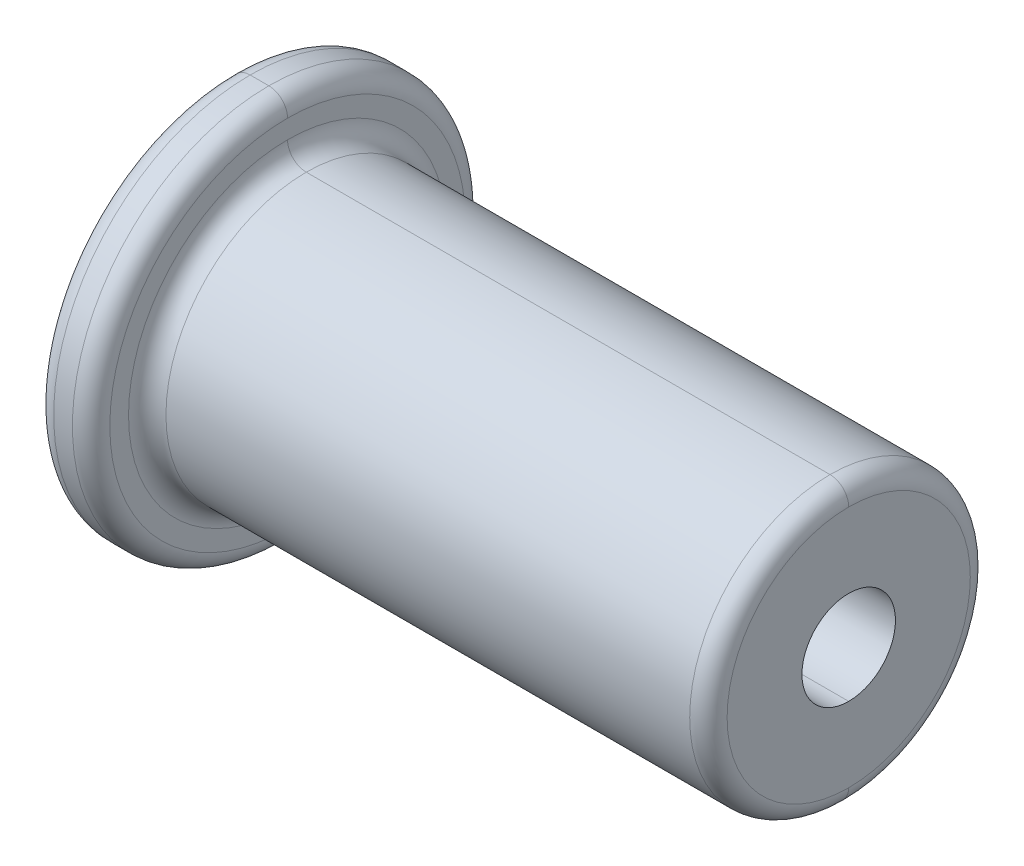
ISO-10303-21;
HEADER;
FILE_DESCRIPTION(('STEP AP214'),'2;1');
FILE_NAME('part.step','',(''),(''),'','','');
FILE_SCHEMA(('AUTOMOTIVE_DESIGN { 1 0 10303 214 1 1 1 1 }'));
ENDSEC;
DATA;
#1=APPLICATION_CONTEXT('core data for automotive mechanical design processes');
#2=APPLICATION_PROTOCOL_DEFINITION('international standard','automotive_design',2000,#1);
#3=PRODUCT_CONTEXT('',#1,'mechanical');
#4=PRODUCT('Part','Part','',(#3));
#5=PRODUCT_RELATED_PRODUCT_CATEGORY('part','',(#4));
#6=PRODUCT_DEFINITION_FORMATION('','',#4);
#7=PRODUCT_DEFINITION_CONTEXT('part definition',#1,'design');
#8=PRODUCT_DEFINITION('design','',#6,#7);
#9=PRODUCT_DEFINITION_SHAPE('','',#8);
#10=(LENGTH_UNIT() NAMED_UNIT(*) SI_UNIT(.MILLI.,.METRE.));
#11=(NAMED_UNIT(*) PLANE_ANGLE_UNIT() SI_UNIT($,.RADIAN.));
#12=(NAMED_UNIT(*) SI_UNIT($,.STERADIAN.) SOLID_ANGLE_UNIT());
#13=UNCERTAINTY_MEASURE_WITH_UNIT(LENGTH_MEASURE(1.E-05),#10,'distance_accuracy_value','');
#14=(GEOMETRIC_REPRESENTATION_CONTEXT(3) GLOBAL_UNCERTAINTY_ASSIGNED_CONTEXT((#13)) GLOBAL_UNIT_ASSIGNED_CONTEXT((#10,
#11,#12)) REPRESENTATION_CONTEXT('',''));
#15=CARTESIAN_POINT('',(0.,0.,0.));
#16=DIRECTION('',(0.,0.,1.));
#17=DIRECTION('',(1.,0.,0.));
#18=AXIS2_PLACEMENT_3D('',#15,#16,#17);
#19=CARTESIAN_POINT('',(20.1098363142858,1.5,0.));
#20=DIRECTION('',(-1.,0.,0.));
#21=DIRECTION('',(0.,1.,0.));
#22=AXIS2_PLACEMENT_3D('',#19,#20,#21);
#23=PLANE('',#22);
#24=CARTESIAN_POINT('',(20.1098363142858,-1.,0.));
#25=DIRECTION('',(-1.,0.,0.));
#26=DIRECTION('',(0.,-1.,0.));
#27=AXIS2_PLACEMENT_3D('',#24,#25,#26);
#28=CIRCLE('',#27,2.5);
#29=CARTESIAN_POINT('',(20.1098363142858,-3.5,0.));
#30=VERTEX_POINT('',#29);
#31=CARTESIAN_POINT('',(20.1098363142858,1.5,0.));
#32=VERTEX_POINT('',#31);
#33=EDGE_CURVE('E10',#30,#32,#28,.T.);
#34=ORIENTED_EDGE('',*,*,#33,.F.);
#35=CARTESIAN_POINT('',(20.1098363142858,-1.,0.));
#36=DIRECTION('',(-1.,0.,0.));
#37=DIRECTION('',(0.,-1.,0.));
#38=AXIS2_PLACEMENT_3D('',#35,#36,#37);
#39=CIRCLE('',#38,2.5);
#40=EDGE_CURVE('E377',#32,#30,#39,.T.);
#41=ORIENTED_EDGE('',*,*,#40,.F.);
#42=EDGE_LOOP('',(#34,#41));
#43=FACE_BOUND('',#42,.T.);
#44=ADVANCED_FACE('F16',(#43),#23,.F.);
#45=CARTESIAN_POINT('',(-15.5422306458491,-1.,0.));
#46=DIRECTION('',(-1.,0.,0.));
#47=DIRECTION('',(0.,-1.,0.));
#48=AXIS2_PLACEMENT_3D('',#45,#46,#47);
#49=CYLINDRICAL_SURFACE('',#48,2.5);
#50=DIRECTION('',(-1.,0.,0.));
#51=VECTOR('',#50,1.);
#52=CARTESIAN_POINT('',(-15.5422306458491,1.5,0.));
#53=LINE('',#52,#51);
#54=CARTESIAN_POINT('',(25.9464285714286,1.5,0.));
#55=VERTEX_POINT('',#54);
#56=EDGE_CURVE('E381',#55,#32,#53,.T.);
#57=ORIENTED_EDGE('',*,*,#56,.F.);
#58=CARTESIAN_POINT('',(25.9464285714286,-1.,0.));
#59=DIRECTION('',(-1.,0.,0.));
#60=DIRECTION('',(0.,-1.,0.));
#61=AXIS2_PLACEMENT_3D('',#58,#59,#60);
#62=CIRCLE('',#61,2.5);
#63=CARTESIAN_POINT('',(25.9464285714286,-3.5,0.));
#64=VERTEX_POINT('',#63);
#65=EDGE_CURVE('E27',#64,#55,#62,.T.);
#66=ORIENTED_EDGE('',*,*,#65,.F.);
#67=DIRECTION('',(-1.,0.,0.));
#68=VECTOR('',#67,1.);
#69=CARTESIAN_POINT('',(-15.5422306458491,-3.5,0.));
#70=LINE('',#69,#68);
#71=EDGE_CURVE('E265',#64,#30,#70,.T.);
#72=ORIENTED_EDGE('',*,*,#71,.T.);
#73=ORIENTED_EDGE('',*,*,#33,.T.);
#74=EDGE_LOOP('',(#57,#66,#72,#73));
#75=FACE_BOUND('',#74,.T.);
#76=ADVANCED_FACE('F465',(#75),#49,.F.);
#77=CARTESIAN_POINT('',(25.9464285714286,5.5,0.));
#78=DIRECTION('',(-1.,0.,0.));
#79=DIRECTION('',(0.,1.,0.));
#80=AXIS2_PLACEMENT_3D('',#77,#78,#79);
#81=PLANE('',#80);
#82=ORIENTED_EDGE('',*,*,#65,.T.);
#83=CARTESIAN_POINT('',(25.9464285714286,-1.,0.));
#84=DIRECTION('',(-1.,0.,0.));
#85=DIRECTION('',(0.,-1.,0.));
#86=AXIS2_PLACEMENT_3D('',#83,#84,#85);
#87=CIRCLE('',#86,2.5);
#88=EDGE_CURVE('E411',#55,#64,#87,.T.);
#89=ORIENTED_EDGE('',*,*,#88,.T.);
#90=EDGE_LOOP('',(#82,#89));
#91=FACE_BOUND('',#90,.T.);
#92=CARTESIAN_POINT('',(25.9464285714286,-1.,0.));
#93=DIRECTION('',(-1.,0.,0.));
#94=DIRECTION('',(0.,-1.,0.));
#95=AXIS2_PLACEMENT_3D('',#92,#93,#94);
#96=CIRCLE('',#95,6.5);
#97=CARTESIAN_POINT('',(25.9464285714286,-7.5,0.));
#98=VERTEX_POINT('',#97);
#99=CARTESIAN_POINT('',(25.9464285714286,5.5,0.));
#100=VERTEX_POINT('',#99);
#101=EDGE_CURVE('E260',#98,#100,#96,.T.);
#102=ORIENTED_EDGE('',*,*,#101,.F.);
#103=CARTESIAN_POINT('',(25.9464285714286,-1.,0.));
#104=DIRECTION('',(-1.,0.,0.));
#105=DIRECTION('',(0.,-1.,0.));
#106=AXIS2_PLACEMENT_3D('',#103,#104,#105);
#107=CIRCLE('',#106,6.5);
#108=EDGE_CURVE('E173',#100,#98,#107,.T.);
#109=ORIENTED_EDGE('',*,*,#108,.F.);
#110=EDGE_LOOP('',(#102,#109));
#111=FACE_BOUND('',#110,.T.);
#112=ADVANCED_FACE('F470',(#91,#111),#81,.F.);
#113=CARTESIAN_POINT('',(24.9464285714286,-1.,0.));
#114=DIRECTION('',(-1.,0.,0.));
#115=DIRECTION('',(0.,-1.,0.));
#116=AXIS2_PLACEMENT_3D('',#113,#114,#115);
#117=TOROIDAL_SURFACE('',#116,6.5,1.);
#118=CARTESIAN_POINT('',(24.9464285714286,5.5,0.));
#119=DIRECTION('',(0.,0.,1.));
#120=DIRECTION('',(0.,-1.,0.));
#121=AXIS2_PLACEMENT_3D('',#118,#119,#120);
#122=CIRCLE('',#121,1.);
#123=CARTESIAN_POINT('',(24.9464285714286,6.5,0.));
#124=VERTEX_POINT('',#123);
#125=EDGE_CURVE('E264',#100,#124,#122,.T.);
#126=ORIENTED_EDGE('',*,*,#125,.F.);
#127=ORIENTED_EDGE('',*,*,#108,.T.);
#128=CARTESIAN_POINT('',(24.9464285714286,-7.5,0.));
#129=DIRECTION('',(0.,0.,-1.));
#130=DIRECTION('',(-1.,0.,0.));
#131=AXIS2_PLACEMENT_3D('',#128,#129,#130);
#132=CIRCLE('',#131,1.);
#133=CARTESIAN_POINT('',(24.9464285714286,-8.5,0.));
#134=VERTEX_POINT('',#133);
#135=EDGE_CURVE('E236',#98,#134,#132,.T.);
#136=ORIENTED_EDGE('',*,*,#135,.T.);
#137=CARTESIAN_POINT('',(24.9464285714286,-1.,0.));
#138=DIRECTION('',(-1.,0.,0.));
#139=DIRECTION('',(0.,-1.,0.));
#140=AXIS2_PLACEMENT_3D('',#137,#138,#139);
#141=CIRCLE('',#140,7.5);
#142=EDGE_CURVE('E268',#124,#134,#141,.T.);
#143=ORIENTED_EDGE('',*,*,#142,.F.);
#144=EDGE_LOOP('',(#126,#127,#136,#143));
#145=FACE_BOUND('',#144,.T.);
#146=ADVANCED_FACE('F489',(#145),#117,.T.);
#147=CARTESIAN_POINT('',(-15.5422306458491,-1.,0.));
#148=DIRECTION('',(-1.,0.,0.));
#149=DIRECTION('',(0.,-1.,0.));
#150=AXIS2_PLACEMENT_3D('',#147,#148,#149);
#151=CYLINDRICAL_SURFACE('',#150,7.5);
#152=DIRECTION('',(-1.,0.,0.));
#153=VECTOR('',#152,1.);
#154=CARTESIAN_POINT('',(-15.5422306458491,6.5,0.));
#155=LINE('',#154,#153);
#156=CARTESIAN_POINT('',(-3.05357142857142,6.5,0.));
#157=VERTEX_POINT('',#156);
#158=EDGE_CURVE('E210',#124,#157,#155,.T.);
#159=ORIENTED_EDGE('',*,*,#158,.F.);
#160=ORIENTED_EDGE('',*,*,#142,.T.);
#161=DIRECTION('',(-1.,0.,0.));
#162=VECTOR('',#161,1.);
#163=CARTESIAN_POINT('',(-15.5422306458491,-8.5,0.));
#164=LINE('',#163,#162);
#165=CARTESIAN_POINT('',(-3.05357142857142,-8.5,0.));
#166=VERTEX_POINT('',#165);
#167=EDGE_CURVE('E213',#134,#166,#164,.T.);
#168=ORIENTED_EDGE('',*,*,#167,.T.);
#169=CARTESIAN_POINT('',(-3.05357142857142,-1.,0.));
#170=DIRECTION('',(-1.,0.,0.));
#171=DIRECTION('',(0.,-1.,0.));
#172=AXIS2_PLACEMENT_3D('',#169,#170,#171);
#173=CIRCLE('',#172,7.5);
#174=EDGE_CURVE('E206',#157,#166,#173,.T.);
#175=ORIENTED_EDGE('',*,*,#174,.F.);
#176=EDGE_LOOP('',(#159,#160,#168,#175));
#177=FACE_BOUND('',#176,.T.);
#178=ADVANCED_FACE('F208',(#177),#151,.T.);
#179=CARTESIAN_POINT('',(-3.05357142857144,-1.,0.));
#180=DIRECTION('',(-1.,0.,0.));
#181=DIRECTION('',(0.,-1.,0.));
#182=AXIS2_PLACEMENT_3D('',#179,#180,#181);
#183=TOROIDAL_SURFACE('',#182,8.5,1.);
#184=CARTESIAN_POINT('',(-3.05357142857144,7.5,0.));
#185=DIRECTION('',(0.,0.,1.));
#186=DIRECTION('',(0.,-1.,0.));
#187=AXIS2_PLACEMENT_3D('',#184,#185,#186);
#188=CIRCLE('',#187,1.);
#189=CARTESIAN_POINT('',(-4.05357142857144,7.5,0.));
#190=VERTEX_POINT('',#189);
#191=EDGE_CURVE('E218',#190,#157,#188,.T.);
#192=ORIENTED_EDGE('',*,*,#191,.F.);
#193=CARTESIAN_POINT('',(-4.05357142857144,-1.,0.));
#194=DIRECTION('',(-1.,0.,0.));
#195=DIRECTION('',(0.,-1.,0.));
#196=AXIS2_PLACEMENT_3D('',#193,#194,#195);
#197=CIRCLE('',#196,8.5);
#198=CARTESIAN_POINT('',(-4.05357142857144,-9.5,0.));
#199=VERTEX_POINT('',#198);
#200=EDGE_CURVE('E189',#199,#190,#197,.T.);
#201=ORIENTED_EDGE('',*,*,#200,.F.);
#202=CARTESIAN_POINT('',(-3.05357142857144,-9.5,0.));
#203=DIRECTION('',(0.,0.,-1.));
#204=DIRECTION('',(-1.,0.,0.));
#205=AXIS2_PLACEMENT_3D('',#202,#203,#204);
#206=CIRCLE('',#205,1.);
#207=EDGE_CURVE('E217',#199,#166,#206,.T.);
#208=ORIENTED_EDGE('',*,*,#207,.T.);
#209=CARTESIAN_POINT('',(-3.05357142857142,-1.,0.));
#210=DIRECTION('',(-1.,0.,0.));
#211=DIRECTION('',(0.,-1.,0.));
#212=AXIS2_PLACEMENT_3D('',#209,#210,#211);
#213=CIRCLE('',#212,7.5);
#214=EDGE_CURVE('E226',#166,#157,#213,.T.);
#215=ORIENTED_EDGE('',*,*,#214,.T.);
#216=EDGE_LOOP('',(#192,#201,#208,#215));
#217=FACE_BOUND('',#216,.T.);
#218=ADVANCED_FACE('F227',(#217),#183,.F.);
#219=CARTESIAN_POINT('',(-4.05357142857144,7.5,0.));
#220=DIRECTION('',(-1.,0.,0.));
#221=DIRECTION('',(0.,1.,0.));
#222=AXIS2_PLACEMENT_3D('',#219,#220,#221);
#223=PLANE('',#222);
#224=ORIENTED_EDGE('',*,*,#200,.T.);
#225=CARTESIAN_POINT('',(-4.05357142857144,-1.,0.));
#226=DIRECTION('',(-1.,0.,0.));
#227=DIRECTION('',(0.,-1.,0.));
#228=AXIS2_PLACEMENT_3D('',#225,#226,#227);
#229=CIRCLE('',#228,8.5);
#230=EDGE_CURVE('E223',#190,#199,#229,.T.);
#231=ORIENTED_EDGE('',*,*,#230,.T.);
#232=EDGE_LOOP('',(#224,#231));
#233=FACE_BOUND('',#232,.T.);
#234=CARTESIAN_POINT('',(-4.05357142857144,-1.,0.));
#235=DIRECTION('',(-1.,0.,0.));
#236=DIRECTION('',(0.,-1.,0.));
#237=AXIS2_PLACEMENT_3D('',#234,#235,#236);
#238=CIRCLE('',#237,9.5);
#239=CARTESIAN_POINT('',(-4.05357142857144,-10.5,0.));
#240=VERTEX_POINT('',#239);
#241=CARTESIAN_POINT('',(-4.05357142857144,8.5,0.));
#242=VERTEX_POINT('',#241);
#243=EDGE_CURVE('E291',#240,#242,#238,.T.);
#244=ORIENTED_EDGE('',*,*,#243,.F.);
#245=CARTESIAN_POINT('',(-4.05357142857144,-1.,0.));
#246=DIRECTION('',(-1.,0.,0.));
#247=DIRECTION('',(0.,-1.,0.));
#248=AXIS2_PLACEMENT_3D('',#245,#246,#247);
#249=CIRCLE('',#248,9.5);
#250=EDGE_CURVE('E288',#242,#240,#249,.T.);
#251=ORIENTED_EDGE('',*,*,#250,.F.);
#252=EDGE_LOOP('',(#244,#251));
#253=FACE_BOUND('',#252,.T.);
#254=ADVANCED_FACE('F503',(#233,#253),#223,.F.);
#255=CARTESIAN_POINT('',(-5.05357142857143,-1.,0.));
#256=DIRECTION('',(-1.,0.,0.));
#257=DIRECTION('',(0.,-1.,0.));
#258=AXIS2_PLACEMENT_3D('',#255,#256,#257);
#259=TOROIDAL_SURFACE('',#258,9.5,1.);
#260=CARTESIAN_POINT('',(-5.05357142857143,8.5,0.));
#261=DIRECTION('',(0.,0.,1.));
#262=DIRECTION('',(0.,-1.,0.));
#263=AXIS2_PLACEMENT_3D('',#260,#261,#262);
#264=CIRCLE('',#263,1.);
#265=CARTESIAN_POINT('',(-5.05357142857144,9.5,0.));
#266=VERTEX_POINT('',#265);
#267=EDGE_CURVE('E302',#242,#266,#264,.T.);
#268=ORIENTED_EDGE('',*,*,#267,.F.);
#269=ORIENTED_EDGE('',*,*,#250,.T.);
#270=CARTESIAN_POINT('',(-5.05357142857143,-10.5,0.));
#271=DIRECTION('',(0.,0.,-1.));
#272=DIRECTION('',(-1.,0.,0.));
#273=AXIS2_PLACEMENT_3D('',#270,#271,#272);
#274=CIRCLE('',#273,1.);
#275=CARTESIAN_POINT('',(-5.05357142857144,-11.5,0.));
#276=VERTEX_POINT('',#275);
#277=EDGE_CURVE('E269',#240,#276,#274,.T.);
#278=ORIENTED_EDGE('',*,*,#277,.T.);
#279=CARTESIAN_POINT('',(-5.05357142857144,-1.,0.));
#280=DIRECTION('',(-1.,0.,0.));
#281=DIRECTION('',(0.,-1.,0.));
#282=AXIS2_PLACEMENT_3D('',#279,#280,#281);
#283=CIRCLE('',#282,10.5);
#284=EDGE_CURVE('E285',#266,#276,#283,.T.);
#285=ORIENTED_EDGE('',*,*,#284,.F.);
#286=EDGE_LOOP('',(#268,#269,#278,#285));
#287=FACE_BOUND('',#286,.T.);
#288=ADVANCED_FACE('F500',(#287),#259,.T.);
#289=CARTESIAN_POINT('',(-15.5422306458491,-1.,0.));
#290=DIRECTION('',(-1.,0.,0.));
#291=DIRECTION('',(0.,-1.,0.));
#292=AXIS2_PLACEMENT_3D('',#289,#290,#291);
#293=CYLINDRICAL_SURFACE('',#292,10.5);
#294=DIRECTION('',(-1.,0.,0.));
#295=VECTOR('',#294,1.);
#296=CARTESIAN_POINT('',(-15.5422306458491,9.5,0.));
#297=LINE('',#296,#295);
#298=CARTESIAN_POINT('',(-6.05357142857143,9.5,0.));
#299=VERTEX_POINT('',#298);
#300=EDGE_CURVE('E273',#266,#299,#297,.T.);
#301=ORIENTED_EDGE('',*,*,#300,.F.);
#302=ORIENTED_EDGE('',*,*,#284,.T.);
#303=DIRECTION('',(-1.,0.,0.));
#304=VECTOR('',#303,1.);
#305=CARTESIAN_POINT('',(-15.5422306458491,-11.5,0.));
#306=LINE('',#305,#304);
#307=CARTESIAN_POINT('',(-6.05357142857143,-11.5,0.));
#308=VERTEX_POINT('',#307);
#309=EDGE_CURVE('E352',#276,#308,#306,.T.);
#310=ORIENTED_EDGE('',*,*,#309,.T.);
#311=CARTESIAN_POINT('',(-6.05357142857143,-1.,0.));
#312=DIRECTION('',(-1.,0.,0.));
#313=DIRECTION('',(0.,-1.,0.));
#314=AXIS2_PLACEMENT_3D('',#311,#312,#313);
#315=CIRCLE('',#314,10.5);
#316=EDGE_CURVE('E20',#299,#308,#315,.T.);
#317=ORIENTED_EDGE('',*,*,#316,.F.);
#318=EDGE_LOOP('',(#301,#302,#310,#317));
#319=FACE_BOUND('',#318,.T.);
#320=ADVANCED_FACE('F502',(#319),#293,.T.);
#321=CARTESIAN_POINT('',(-6.05357142857143,-1.,0.));
#322=DIRECTION('',(-1.,0.,0.));
#323=DIRECTION('',(0.,-1.,0.));
#324=AXIS2_PLACEMENT_3D('',#321,#322,#323);
#325=TOROIDAL_SURFACE('',#324,9.5,1.);
#326=CARTESIAN_POINT('',(-6.05357142857143,8.5,0.));
#327=DIRECTION('',(0.,0.,1.));
#328=DIRECTION('',(0.,-1.,0.));
#329=AXIS2_PLACEMENT_3D('',#326,#327,#328);
#330=CIRCLE('',#329,1.);
#331=CARTESIAN_POINT('',(-7.05357142857143,8.5,0.));
#332=VERTEX_POINT('',#331);
#333=EDGE_CURVE('E314',#299,#332,#330,.T.);
#334=ORIENTED_EDGE('',*,*,#333,.F.);
#335=ORIENTED_EDGE('',*,*,#316,.T.);
#336=CARTESIAN_POINT('',(-6.05357142857143,-10.5,0.));
#337=DIRECTION('',(0.,0.,-1.));
#338=DIRECTION('',(-1.,0.,0.));
#339=AXIS2_PLACEMENT_3D('',#336,#337,#338);
#340=CIRCLE('',#339,1.);
#341=CARTESIAN_POINT('',(-7.05357142857143,-10.5,0.));
#342=VERTEX_POINT('',#341);
#343=EDGE_CURVE('E244',#308,#342,#340,.T.);
#344=ORIENTED_EDGE('',*,*,#343,.T.);
#345=CARTESIAN_POINT('',(-7.05357142857143,-1.,0.));
#346=DIRECTION('',(-1.,0.,0.));
#347=DIRECTION('',(0.,-1.,0.));
#348=AXIS2_PLACEMENT_3D('',#345,#346,#347);
#349=CIRCLE('',#348,9.5);
#350=EDGE_CURVE('E319',#332,#342,#349,.T.);
#351=ORIENTED_EDGE('',*,*,#350,.F.);
#352=EDGE_LOOP('',(#334,#335,#344,#351));
#353=FACE_BOUND('',#352,.T.);
#354=ADVANCED_FACE('F509',(#353),#325,.T.);
#355=CARTESIAN_POINT('',(-7.05357142857143,8.5,0.));
#356=DIRECTION('',(1.,0.,0.));
#357=DIRECTION('',(0.,1.,0.));
#358=AXIS2_PLACEMENT_3D('',#355,#356,#357);
#359=PLANE('',#358);
#360=CARTESIAN_POINT('',(-7.05357142857143,-1.,0.));
#361=DIRECTION('',(-1.,0.,0.));
#362=DIRECTION('',(0.,-1.,0.));
#363=AXIS2_PLACEMENT_3D('',#360,#361,#362);
#364=CIRCLE('',#363,6.19642857142858);
#365=CARTESIAN_POINT('',(-7.05357142857143,-7.19642857142858,0.));
#366=VERTEX_POINT('',#365);
#367=CARTESIAN_POINT('',(-7.05357142857143,5.19642857142858,0.));
#368=VERTEX_POINT('',#367);
#369=EDGE_CURVE('E309',#366,#368,#364,.T.);
#370=ORIENTED_EDGE('',*,*,#369,.F.);
#371=CARTESIAN_POINT('',(-7.05357142857143,-1.,0.));
#372=DIRECTION('',(-1.,0.,0.));
#373=DIRECTION('',(0.,-1.,0.));
#374=AXIS2_PLACEMENT_3D('',#371,#372,#373);
#375=CIRCLE('',#374,6.19642857142858);
#376=EDGE_CURVE('E326',#368,#366,#375,.T.);
#377=ORIENTED_EDGE('',*,*,#376,.F.);
#378=EDGE_LOOP('',(#370,#377));
#379=FACE_BOUND('',#378,.T.);
#380=CARTESIAN_POINT('',(-7.05357142857143,-1.,0.));
#381=DIRECTION('',(-1.,0.,0.));
#382=DIRECTION('',(0.,-1.,0.));
#383=AXIS2_PLACEMENT_3D('',#380,#381,#382);
#384=CIRCLE('',#383,9.5);
#385=EDGE_CURVE('E249',#342,#332,#384,.T.);
#386=ORIENTED_EDGE('',*,*,#385,.T.);
#387=ORIENTED_EDGE('',*,*,#350,.T.);
#388=EDGE_LOOP('',(#386,#387));
#389=FACE_BOUND('',#388,.T.);
#390=ADVANCED_FACE('F533',(#379,#389),#359,.F.);
#391=CARTESIAN_POINT('',(-8.05357142857143,-1.,0.));
#392=DIRECTION('',(-1.,0.,0.));
#393=DIRECTION('',(0.,-1.,0.));
#394=AXIS2_PLACEMENT_3D('',#391,#392,#393);
#395=TOROIDAL_SURFACE('',#394,6.19642857142857,1.);
#396=CARTESIAN_POINT('',(-8.05357142857143,5.19642857142857,0.));
#397=DIRECTION('',(0.,0.,1.));
#398=DIRECTION('',(0.,-1.,0.));
#399=AXIS2_PLACEMENT_3D('',#396,#397,#398);
#400=CIRCLE('',#399,1.);
#401=CARTESIAN_POINT('',(-8.05357142857144,4.19642857142857,0.));
#402=VERTEX_POINT('',#401);
#403=EDGE_CURVE('E322',#402,#368,#400,.T.);
#404=ORIENTED_EDGE('',*,*,#403,.F.);
#405=CARTESIAN_POINT('',(-8.05357142857144,-1.,0.));
#406=DIRECTION('',(-1.,0.,0.));
#407=DIRECTION('',(0.,-1.,0.));
#408=AXIS2_PLACEMENT_3D('',#405,#406,#407);
#409=CIRCLE('',#408,5.19642857142857);
#410=CARTESIAN_POINT('',(-8.05357142857144,-6.19642857142857,0.));
#411=VERTEX_POINT('',#410);
#412=EDGE_CURVE('E296',#411,#402,#409,.T.);
#413=ORIENTED_EDGE('',*,*,#412,.F.);
#414=CARTESIAN_POINT('',(-8.05357142857143,-7.19642857142857,0.));
#415=DIRECTION('',(0.,0.,-1.));
#416=DIRECTION('',(-1.,0.,0.));
#417=AXIS2_PLACEMENT_3D('',#414,#415,#416);
#418=CIRCLE('',#417,1.);
#419=EDGE_CURVE('E346',#411,#366,#418,.T.);
#420=ORIENTED_EDGE('',*,*,#419,.T.);
#421=ORIENTED_EDGE('',*,*,#369,.T.);
#422=EDGE_LOOP('',(#404,#413,#420,#421));
#423=FACE_BOUND('',#422,.T.);
#424=ADVANCED_FACE('F535',(#423),#395,.F.);
#425=CARTESIAN_POINT('',(-15.5422306458491,-1.,0.));
#426=DIRECTION('',(-1.,0.,0.));
#427=DIRECTION('',(0.,-1.,0.));
#428=AXIS2_PLACEMENT_3D('',#425,#426,#427);
#429=CYLINDRICAL_SURFACE('',#428,5.19642857142857);
#430=DIRECTION('',(-1.,0.,0.));
#431=VECTOR('',#430,1.);
#432=CARTESIAN_POINT('',(-15.5422306458491,4.19642857142857,0.));
#433=LINE('',#432,#431);
#434=CARTESIAN_POINT('',(-8.10714285714285,4.19642857142857,0.));
#435=VERTEX_POINT('',#434);
#436=EDGE_CURVE('E292',#402,#435,#433,.T.);
#437=ORIENTED_EDGE('',*,*,#436,.F.);
#438=CARTESIAN_POINT('',(-8.05357142857144,-1.,0.));
#439=DIRECTION('',(-1.,0.,0.));
#440=DIRECTION('',(0.,-1.,0.));
#441=AXIS2_PLACEMENT_3D('',#438,#439,#440);
#442=CIRCLE('',#441,5.19642857142857);
#443=EDGE_CURVE('E248',#402,#411,#442,.T.);
#444=ORIENTED_EDGE('',*,*,#443,.T.);
#445=DIRECTION('',(-1.,0.,0.));
#446=VECTOR('',#445,1.);
#447=CARTESIAN_POINT('',(-15.5422306458491,-6.19642857142857,0.));
#448=LINE('',#447,#446);
#449=CARTESIAN_POINT('',(-8.10714285714285,-6.19642857142857,0.));
#450=VERTEX_POINT('',#449);
#451=EDGE_CURVE('E362',#411,#450,#448,.T.);
#452=ORIENTED_EDGE('',*,*,#451,.T.);
#453=CARTESIAN_POINT('',(-8.10714285714285,-1.,0.));
#454=DIRECTION('',(-1.,0.,0.));
#455=DIRECTION('',(0.,-1.,0.));
#456=AXIS2_PLACEMENT_3D('',#453,#454,#455);
#457=CIRCLE('',#456,5.19642857142857);
#458=EDGE_CURVE('E306',#435,#450,#457,.T.);
#459=ORIENTED_EDGE('',*,*,#458,.F.);
#460=EDGE_LOOP('',(#437,#444,#452,#459));
#461=FACE_BOUND('',#460,.T.);
#462=ADVANCED_FACE('F436',(#461),#429,.T.);
#463=CARTESIAN_POINT('',(-8.10714285714286,-1.,0.));
#464=DIRECTION('',(-1.,0.,0.));
#465=DIRECTION('',(0.,-1.,0.));
#466=AXIS2_PLACEMENT_3D('',#463,#464,#465);
#467=TOROIDAL_SURFACE('',#466,4.19642857142857,1.);
#468=CARTESIAN_POINT('',(-8.10714285714286,3.19642857142858,0.));
#469=DIRECTION('',(0.,0.,1.));
#470=DIRECTION('',(0.,-1.,0.));
#471=AXIS2_PLACEMENT_3D('',#468,#469,#470);
#472=CIRCLE('',#471,1.);
#473=CARTESIAN_POINT('',(-9.10714285714286,3.19642857142857,0.));
#474=VERTEX_POINT('',#473);
#475=EDGE_CURVE('E278',#435,#474,#472,.T.);
#476=ORIENTED_EDGE('',*,*,#475,.F.);
#477=ORIENTED_EDGE('',*,*,#458,.T.);
#478=CARTESIAN_POINT('',(-8.10714285714286,-5.19642857142857,0.));
#479=DIRECTION('',(0.,0.,-1.));
#480=DIRECTION('',(-1.,0.,0.));
#481=AXIS2_PLACEMENT_3D('',#478,#479,#480);
#482=CIRCLE('',#481,1.);
#483=CARTESIAN_POINT('',(-9.10714285714286,-5.19642857142857,0.));
#484=VERTEX_POINT('',#483);
#485=EDGE_CURVE('E254',#450,#484,#482,.T.);
#486=ORIENTED_EDGE('',*,*,#485,.T.);
#487=CARTESIAN_POINT('',(-9.10714285714286,-1.,0.));
#488=DIRECTION('',(-1.,0.,0.));
#489=DIRECTION('',(0.,-1.,0.));
#490=AXIS2_PLACEMENT_3D('',#487,#488,#489);
#491=CIRCLE('',#490,4.19642857142856);
#492=EDGE_CURVE('E310',#474,#484,#491,.T.);
#493=ORIENTED_EDGE('',*,*,#492,.F.);
#494=EDGE_LOOP('',(#476,#477,#486,#493));
#495=FACE_BOUND('',#494,.T.);
#496=ADVANCED_FACE('F447',(#495),#467,.T.);
#497=CARTESIAN_POINT('',(-9.10714285714286,3.19642857142857,0.));
#498=DIRECTION('',(1.,0.,0.));
#499=DIRECTION('',(0.,1.,0.));
#500=AXIS2_PLACEMENT_3D('',#497,#498,#499);
#501=PLANE('',#500);
#502=CARTESIAN_POINT('',(-9.10714285714286,-1.,0.));
#503=DIRECTION('',(-1.,0.,0.));
#504=DIRECTION('',(0.,-1.,0.));
#505=AXIS2_PLACEMENT_3D('',#502,#503,#504);
#506=CIRCLE('',#505,3.125);
#507=CARTESIAN_POINT('',(-9.10714285714286,-4.125,0.));
#508=VERTEX_POINT('',#507);
#509=CARTESIAN_POINT('',(-9.10714285714286,2.125,0.));
#510=VERTEX_POINT('',#509);
#511=EDGE_CURVE('E301',#508,#510,#506,.T.);
#512=ORIENTED_EDGE('',*,*,#511,.F.);
#513=CARTESIAN_POINT('',(-9.10714285714286,-1.,0.));
#514=DIRECTION('',(-1.,0.,0.));
#515=DIRECTION('',(0.,-1.,0.));
#516=AXIS2_PLACEMENT_3D('',#513,#514,#515);
#517=CIRCLE('',#516,3.125);
#518=EDGE_CURVE('E279',#510,#508,#517,.T.);
#519=ORIENTED_EDGE('',*,*,#518,.F.);
#520=EDGE_LOOP('',(#512,#519));
#521=FACE_BOUND('',#520,.T.);
#522=CARTESIAN_POINT('',(-9.10714285714286,-1.,0.));
#523=DIRECTION('',(-1.,0.,0.));
#524=DIRECTION('',(0.,-1.,0.));
#525=AXIS2_PLACEMENT_3D('',#522,#523,#524);
#526=CIRCLE('',#525,4.19642857142856);
#527=EDGE_CURVE('E259',#484,#474,#526,.T.);
#528=ORIENTED_EDGE('',*,*,#527,.T.);
#529=ORIENTED_EDGE('',*,*,#492,.T.);
#530=EDGE_LOOP('',(#528,#529));
#531=FACE_BOUND('',#530,.T.);
#532=ADVANCED_FACE('F449',(#521,#531),#501,.F.);
#533=CARTESIAN_POINT('',(-15.5422306458491,-1.,0.));
#534=DIRECTION('',(-1.,0.,0.));
#535=DIRECTION('',(0.,-1.,0.));
#536=AXIS2_PLACEMENT_3D('',#533,#534,#535);
#537=CYLINDRICAL_SURFACE('',#536,3.125);
#538=DIRECTION('',(-1.,0.,0.));
#539=VECTOR('',#538,1.);
#540=CARTESIAN_POINT('',(-15.5422306458491,2.125,0.));
#541=LINE('',#540,#539);
#542=CARTESIAN_POINT('',(-8.05357142857143,2.125,0.));
#543=VERTEX_POINT('',#542);
#544=EDGE_CURVE('E284',#543,#510,#541,.T.);
#545=ORIENTED_EDGE('',*,*,#544,.F.);
#546=CARTESIAN_POINT('',(-8.05357142857143,-1.,0.));
#547=DIRECTION('',(-1.,0.,0.));
#548=DIRECTION('',(0.,-1.,0.));
#549=AXIS2_PLACEMENT_3D('',#546,#547,#548);
#550=CIRCLE('',#549,3.125);
#551=CARTESIAN_POINT('',(-8.05357142857143,-4.125,0.));
#552=VERTEX_POINT('',#551);
#553=EDGE_CURVE('E298',#552,#543,#550,.T.);
#554=ORIENTED_EDGE('',*,*,#553,.F.);
#555=DIRECTION('',(-1.,0.,0.));
#556=VECTOR('',#555,1.);
#557=CARTESIAN_POINT('',(-15.5422306458491,-4.125,0.));
#558=LINE('',#557,#556);
#559=EDGE_CURVE('E283',#552,#508,#558,.T.);
#560=ORIENTED_EDGE('',*,*,#559,.T.);
#561=ORIENTED_EDGE('',*,*,#511,.T.);
#562=EDGE_LOOP('',(#545,#554,#560,#561));
#563=FACE_BOUND('',#562,.T.);
#564=ADVANCED_FACE('F451',(#563),#537,.F.);
#565=CARTESIAN_POINT('',(-8.05357142857143,-1.,0.));
#566=DIRECTION('',(-1.,0.,0.));
#567=DIRECTION('',(0.,-1.,0.));
#568=AXIS2_PLACEMENT_3D('',#565,#566,#567);
#569=TOROIDAL_SURFACE('',#568,2.125,1.);
#570=CARTESIAN_POINT('',(-8.05357142857143,1.125,0.));
#571=DIRECTION('',(0.,0.,1.));
#572=DIRECTION('',(0.,-1.,0.));
#573=AXIS2_PLACEMENT_3D('',#570,#571,#572);
#574=CIRCLE('',#573,1.);
#575=CARTESIAN_POINT('',(-7.05357142857143,1.125,0.));
#576=VERTEX_POINT('',#575);
#577=EDGE_CURVE('E332',#576,#543,#574,.T.);
#578=ORIENTED_EDGE('',*,*,#577,.F.);
#579=CARTESIAN_POINT('',(-7.05357142857143,-1.,0.));
#580=DIRECTION('',(-1.,0.,0.));
#581=DIRECTION('',(0.,-1.,0.));
#582=AXIS2_PLACEMENT_3D('',#579,#580,#581);
#583=CIRCLE('',#582,2.125);
#584=CARTESIAN_POINT('',(-7.05357142857143,-3.125,0.));
#585=VERTEX_POINT('',#584);
#586=EDGE_CURVE('E253',#585,#576,#583,.T.);
#587=ORIENTED_EDGE('',*,*,#586,.F.);
#588=CARTESIAN_POINT('',(-8.05357142857143,-3.125,0.));
#589=DIRECTION('',(0.,0.,-1.));
#590=DIRECTION('',(-1.,0.,0.));
#591=AXIS2_PLACEMENT_3D('',#588,#589,#590);
#592=CIRCLE('',#591,1.);
#593=EDGE_CURVE('E336',#585,#552,#592,.T.);
#594=ORIENTED_EDGE('',*,*,#593,.T.);
#595=ORIENTED_EDGE('',*,*,#553,.T.);
#596=EDGE_LOOP('',(#578,#587,#594,#595));
#597=FACE_BOUND('',#596,.T.);
#598=ADVANCED_FACE('F459',(#597),#569,.F.);
#599=CARTESIAN_POINT('',(-7.05357142857143,1.125,0.));
#600=DIRECTION('',(1.,0.,0.));
#601=DIRECTION('',(0.,1.,0.));
#602=AXIS2_PLACEMENT_3D('',#599,#600,#601);
#603=PLANE('',#602);
#604=CARTESIAN_POINT('',(-7.05357142857143,-1.,0.));
#605=DIRECTION('',(-1.,0.,0.));
#606=DIRECTION('',(0.,-1.,0.));
#607=AXIS2_PLACEMENT_3D('',#604,#605,#606);
#608=CIRCLE('',#607,1.);
#609=CARTESIAN_POINT('',(-7.05357142857143,-2.,0.));
#610=VERTEX_POINT('',#609);
#611=CARTESIAN_POINT('',(-7.05357142857143,0.,0.));
#612=VERTEX_POINT('',#611);
#613=EDGE_CURVE('E318',#610,#612,#608,.T.);
#614=ORIENTED_EDGE('',*,*,#613,.F.);
#615=CARTESIAN_POINT('',(-7.05357142857143,-1.,0.));
#616=DIRECTION('',(-1.,0.,0.));
#617=DIRECTION('',(0.,-1.,0.));
#618=AXIS2_PLACEMENT_3D('',#615,#616,#617);
#619=CIRCLE('',#618,1.);
#620=EDGE_CURVE('E250',#612,#610,#619,.T.);
#621=ORIENTED_EDGE('',*,*,#620,.F.);
#622=EDGE_LOOP('',(#614,#621));
#623=FACE_BOUND('',#622,.T.);
#624=ORIENTED_EDGE('',*,*,#586,.T.);
#625=CARTESIAN_POINT('',(-7.05357142857143,-1.,0.));
#626=DIRECTION('',(-1.,0.,0.));
#627=DIRECTION('',(0.,-1.,0.));
#628=AXIS2_PLACEMENT_3D('',#625,#626,#627);
#629=CIRCLE('',#628,2.125);
#630=EDGE_CURVE('E337',#576,#585,#629,.T.);
#631=ORIENTED_EDGE('',*,*,#630,.T.);
#632=EDGE_LOOP('',(#624,#631));
#633=FACE_BOUND('',#632,.T.);
#634=ADVANCED_FACE('F552',(#623,#633),#603,.F.);
#635=CARTESIAN_POINT('',(-6.05357142857143,-1.,0.));
#636=DIRECTION('',(-1.,0.,0.));
#637=DIRECTION('',(0.,-1.,0.));
#638=AXIS2_PLACEMENT_3D('',#635,#636,#637);
#639=DEGENERATE_TOROIDAL_SURFACE('',#638,1.,1.,.T.);
#640=CARTESIAN_POINT('',(-6.05357142857143,0.,0.));
#641=DIRECTION('',(0.,0.,1.));
#642=DIRECTION('',(0.,-1.,0.));
#643=AXIS2_PLACEMENT_3D('',#640,#641,#642);
#644=CIRCLE('',#643,1.);
#645=CARTESIAN_POINT('',(-6.05357142857143,-1.,0.));
#646=VERTEX_POINT('',#645);
#647=EDGE_CURVE('E315',#612,#646,#644,.T.);
#648=ORIENTED_EDGE('',*,*,#647,.F.);
#649=ORIENTED_EDGE('',*,*,#620,.T.);
#650=CARTESIAN_POINT('',(-6.05357142857143,-2.,0.));
#651=DIRECTION('',(0.,0.,-1.));
#652=DIRECTION('',(-1.,0.,0.));
#653=AXIS2_PLACEMENT_3D('',#650,#651,#652);
#654=CIRCLE('',#653,1.);
#655=EDGE_CURVE('E42',#610,#646,#654,.T.);
#656=ORIENTED_EDGE('',*,*,#655,.T.);
#657=EDGE_LOOP('',(#648,#649,#656));
#658=FACE_BOUND('',#657,.T.);
#659=ADVANCED_FACE('F554',(#658),#639,.T.);
#660=CARTESIAN_POINT('',(-6.05357142857143,-1.,0.));
#661=DIRECTION('',(-1.,0.,0.));
#662=DIRECTION('',(0.,-1.,0.));
#663=AXIS2_PLACEMENT_3D('',#660,#661,#662);
#664=DEGENERATE_TOROIDAL_SURFACE('',#663,1.,1.,.T.);
#665=ORIENTED_EDGE('',*,*,#613,.T.);
#666=ORIENTED_EDGE('',*,*,#647,.T.);
#667=ORIENTED_EDGE('',*,*,#655,.F.);
#668=EDGE_LOOP('',(#665,#666,#667));
#669=FACE_BOUND('',#668,.T.);
#670=ADVANCED_FACE('F562',(#669),#664,.T.);
#671=CARTESIAN_POINT('',(-8.05357142857143,-1.,0.));
#672=DIRECTION('',(-1.,0.,0.));
#673=DIRECTION('',(0.,-1.,0.));
#674=AXIS2_PLACEMENT_3D('',#671,#672,#673);
#675=TOROIDAL_SURFACE('',#674,2.125,1.);
#676=ORIENTED_EDGE('',*,*,#630,.F.);
#677=ORIENTED_EDGE('',*,*,#577,.T.);
#678=CARTESIAN_POINT('',(-8.05357142857143,-1.,0.));
#679=DIRECTION('',(-1.,0.,0.));
#680=DIRECTION('',(0.,-1.,0.));
#681=AXIS2_PLACEMENT_3D('',#678,#679,#680);
#682=CIRCLE('',#681,3.125);
#683=EDGE_CURVE('E258',#543,#552,#682,.T.);
#684=ORIENTED_EDGE('',*,*,#683,.T.);
#685=ORIENTED_EDGE('',*,*,#593,.F.);
#686=EDGE_LOOP('',(#676,#677,#684,#685));
#687=FACE_BOUND('',#686,.T.);
#688=ADVANCED_FACE('F550',(#687),#675,.F.);
#689=CARTESIAN_POINT('',(-15.5422306458491,-1.,0.));
#690=DIRECTION('',(-1.,0.,0.));
#691=DIRECTION('',(0.,-1.,0.));
#692=AXIS2_PLACEMENT_3D('',#689,#690,#691);
#693=CYLINDRICAL_SURFACE('',#692,3.125);
#694=ORIENTED_EDGE('',*,*,#683,.F.);
#695=ORIENTED_EDGE('',*,*,#544,.T.);
#696=ORIENTED_EDGE('',*,*,#518,.T.);
#697=ORIENTED_EDGE('',*,*,#559,.F.);
#698=EDGE_LOOP('',(#694,#695,#696,#697));
#699=FACE_BOUND('',#698,.T.);
#700=ADVANCED_FACE('F547',(#699),#693,.F.);
#701=CARTESIAN_POINT('',(-8.10714285714286,-1.,0.));
#702=DIRECTION('',(-1.,0.,0.));
#703=DIRECTION('',(0.,-1.,0.));
#704=AXIS2_PLACEMENT_3D('',#701,#702,#703);
#705=TOROIDAL_SURFACE('',#704,4.19642857142857,1.);
#706=CARTESIAN_POINT('',(-8.10714285714285,-1.,0.));
#707=DIRECTION('',(-1.,0.,0.));
#708=DIRECTION('',(0.,-1.,0.));
#709=AXIS2_PLACEMENT_3D('',#706,#707,#708);
#710=CIRCLE('',#709,5.19642857142857);
#711=EDGE_CURVE('E295',#450,#435,#710,.T.);
#712=ORIENTED_EDGE('',*,*,#711,.T.);
#713=ORIENTED_EDGE('',*,*,#475,.T.);
#714=ORIENTED_EDGE('',*,*,#527,.F.);
#715=ORIENTED_EDGE('',*,*,#485,.F.);
#716=EDGE_LOOP('',(#712,#713,#714,#715));
#717=FACE_BOUND('',#716,.T.);
#718=ADVANCED_FACE('F18',(#717),#705,.T.);
#719=CARTESIAN_POINT('',(-15.5422306458491,-1.,0.));
#720=DIRECTION('',(-1.,0.,0.));
#721=DIRECTION('',(0.,-1.,0.));
#722=AXIS2_PLACEMENT_3D('',#719,#720,#721);
#723=CYLINDRICAL_SURFACE('',#722,5.19642857142857);
#724=ORIENTED_EDGE('',*,*,#412,.T.);
#725=ORIENTED_EDGE('',*,*,#436,.T.);
#726=ORIENTED_EDGE('',*,*,#711,.F.);
#727=ORIENTED_EDGE('',*,*,#451,.F.);
#728=EDGE_LOOP('',(#724,#725,#726,#727));
#729=FACE_BOUND('',#728,.T.);
#730=ADVANCED_FACE('F441',(#729),#723,.T.);
#731=CARTESIAN_POINT('',(-8.05357142857143,-1.,0.));
#732=DIRECTION('',(-1.,0.,0.));
#733=DIRECTION('',(0.,-1.,0.));
#734=AXIS2_PLACEMENT_3D('',#731,#732,#733);
#735=TOROIDAL_SURFACE('',#734,6.19642857142857,1.);
#736=ORIENTED_EDGE('',*,*,#443,.F.);
#737=ORIENTED_EDGE('',*,*,#403,.T.);
#738=ORIENTED_EDGE('',*,*,#376,.T.);
#739=ORIENTED_EDGE('',*,*,#419,.F.);
#740=EDGE_LOOP('',(#736,#737,#738,#739));
#741=FACE_BOUND('',#740,.T.);
#742=ADVANCED_FACE('F559',(#741),#735,.F.);
#743=CARTESIAN_POINT('',(-6.05357142857143,-1.,0.));
#744=DIRECTION('',(-1.,0.,0.));
#745=DIRECTION('',(0.,-1.,0.));
#746=AXIS2_PLACEMENT_3D('',#743,#744,#745);
#747=TOROIDAL_SURFACE('',#746,9.5,1.);
#748=CARTESIAN_POINT('',(-6.05357142857143,-1.,0.));
#749=DIRECTION('',(-1.,0.,0.));
#750=DIRECTION('',(0.,-1.,0.));
#751=AXIS2_PLACEMENT_3D('',#748,#749,#750);
#752=CIRCLE('',#751,10.5);
#753=EDGE_CURVE('E356',#308,#299,#752,.T.);
#754=ORIENTED_EDGE('',*,*,#753,.T.);
#755=ORIENTED_EDGE('',*,*,#333,.T.);
#756=ORIENTED_EDGE('',*,*,#385,.F.);
#757=ORIENTED_EDGE('',*,*,#343,.F.);
#758=EDGE_LOOP('',(#754,#755,#756,#757));
#759=FACE_BOUND('',#758,.T.);
#760=ADVANCED_FACE('F531',(#759),#747,.T.);
#761=CARTESIAN_POINT('',(-15.5422306458491,-1.,0.));
#762=DIRECTION('',(-1.,0.,0.));
#763=DIRECTION('',(0.,-1.,0.));
#764=AXIS2_PLACEMENT_3D('',#761,#762,#763);
#765=CYLINDRICAL_SURFACE('',#764,10.5);
#766=CARTESIAN_POINT('',(-5.05357142857144,-1.,0.));
#767=DIRECTION('',(-1.,0.,0.));
#768=DIRECTION('',(0.,-1.,0.));
#769=AXIS2_PLACEMENT_3D('',#766,#767,#768);
#770=CIRCLE('',#769,10.5);
#771=EDGE_CURVE('E274',#276,#266,#770,.T.);
#772=ORIENTED_EDGE('',*,*,#771,.T.);
#773=ORIENTED_EDGE('',*,*,#300,.T.);
#774=ORIENTED_EDGE('',*,*,#753,.F.);
#775=ORIENTED_EDGE('',*,*,#309,.F.);
#776=EDGE_LOOP('',(#772,#773,#774,#775));
#777=FACE_BOUND('',#776,.T.);
#778=ADVANCED_FACE('F475',(#777),#765,.T.);
#779=CARTESIAN_POINT('',(-5.05357142857143,-1.,0.));
#780=DIRECTION('',(-1.,0.,0.));
#781=DIRECTION('',(0.,-1.,0.));
#782=AXIS2_PLACEMENT_3D('',#779,#780,#781);
#783=TOROIDAL_SURFACE('',#782,9.5,1.);
#784=ORIENTED_EDGE('',*,*,#243,.T.);
#785=ORIENTED_EDGE('',*,*,#267,.T.);
#786=ORIENTED_EDGE('',*,*,#771,.F.);
#787=ORIENTED_EDGE('',*,*,#277,.F.);
#788=EDGE_LOOP('',(#784,#785,#786,#787));
#789=FACE_BOUND('',#788,.T.);
#790=ADVANCED_FACE('F519',(#789),#783,.T.);
#791=CARTESIAN_POINT('',(-3.05357142857144,-1.,0.));
#792=DIRECTION('',(-1.,0.,0.));
#793=DIRECTION('',(0.,-1.,0.));
#794=AXIS2_PLACEMENT_3D('',#791,#792,#793);
#795=TOROIDAL_SURFACE('',#794,8.5,1.);
#796=ORIENTED_EDGE('',*,*,#230,.F.);
#797=ORIENTED_EDGE('',*,*,#191,.T.);
#798=ORIENTED_EDGE('',*,*,#174,.T.);
#799=ORIENTED_EDGE('',*,*,#207,.F.);
#800=EDGE_LOOP('',(#796,#797,#798,#799));
#801=FACE_BOUND('',#800,.T.);
#802=ADVANCED_FACE('F222',(#801),#795,.F.);
#803=CARTESIAN_POINT('',(-15.5422306458491,-1.,0.));
#804=DIRECTION('',(-1.,0.,0.));
#805=DIRECTION('',(0.,-1.,0.));
#806=AXIS2_PLACEMENT_3D('',#803,#804,#805);
#807=CYLINDRICAL_SURFACE('',#806,7.5);
#808=CARTESIAN_POINT('',(24.9464285714286,-1.,0.));
#809=DIRECTION('',(-1.,0.,0.));
#810=DIRECTION('',(0.,-1.,0.));
#811=AXIS2_PLACEMENT_3D('',#808,#809,#810);
#812=CIRCLE('',#811,7.5);
#813=EDGE_CURVE('E233',#134,#124,#812,.T.);
#814=ORIENTED_EDGE('',*,*,#813,.T.);
#815=ORIENTED_EDGE('',*,*,#158,.T.);
#816=ORIENTED_EDGE('',*,*,#214,.F.);
#817=ORIENTED_EDGE('',*,*,#167,.F.);
#818=EDGE_LOOP('',(#814,#815,#816,#817));
#819=FACE_BOUND('',#818,.T.);
#820=ADVANCED_FACE('F231',(#819),#807,.T.);
#821=CARTESIAN_POINT('',(24.9464285714286,-1.,0.));
#822=DIRECTION('',(-1.,0.,0.));
#823=DIRECTION('',(0.,-1.,0.));
#824=AXIS2_PLACEMENT_3D('',#821,#822,#823);
#825=TOROIDAL_SURFACE('',#824,6.5,1.);
#826=ORIENTED_EDGE('',*,*,#101,.T.);
#827=ORIENTED_EDGE('',*,*,#125,.T.);
#828=ORIENTED_EDGE('',*,*,#813,.F.);
#829=ORIENTED_EDGE('',*,*,#135,.F.);
#830=EDGE_LOOP('',(#826,#827,#828,#829));
#831=FACE_BOUND('',#830,.T.);
#832=ADVANCED_FACE('F479',(#831),#825,.T.);
#833=CARTESIAN_POINT('',(-15.5422306458491,-1.,0.));
#834=DIRECTION('',(-1.,0.,0.));
#835=DIRECTION('',(0.,-1.,0.));
#836=AXIS2_PLACEMENT_3D('',#833,#834,#835);
#837=CYLINDRICAL_SURFACE('',#836,2.5);
#838=ORIENTED_EDGE('',*,*,#88,.F.);
#839=ORIENTED_EDGE('',*,*,#56,.T.);
#840=ORIENTED_EDGE('',*,*,#40,.T.);
#841=ORIENTED_EDGE('',*,*,#71,.F.);
#842=EDGE_LOOP('',(#838,#839,#840,#841));
#843=FACE_BOUND('',#842,.T.);
#844=ADVANCED_FACE('F477',(#843),#837,.F.);
#845=CLOSED_SHELL('',(#44,#76,#112,#146,#178,#218,#254,#288,#320,#354,#390,#424,#462,#496,#532,
#564,#598,#634,#659,#670,#688,#700,#718,#730,#742,#760,#778,#790,#802,#820,#832,#844));
#846=MANIFOLD_SOLID_BREP('B1',#845);
#847=ADVANCED_BREP_SHAPE_REPRESENTATION('',(#18,#846),#14);
#848=SHAPE_DEFINITION_REPRESENTATION(#9,#847);
ENDSEC;
END-ISO-10303-21;
